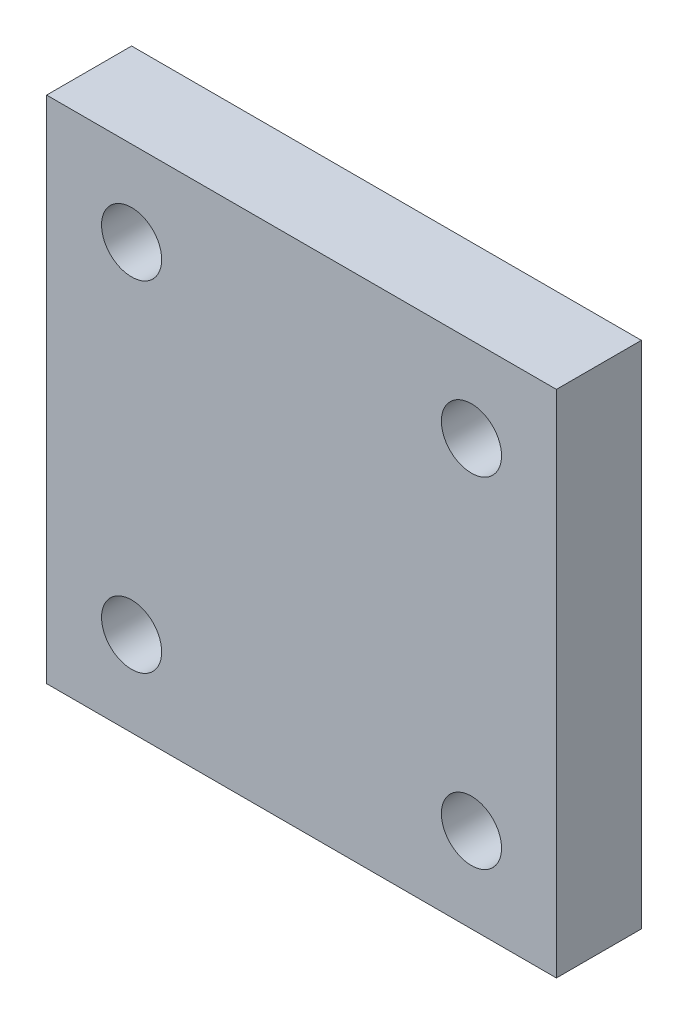
ISO-10303-21;
HEADER;
FILE_DESCRIPTION(('STEP AP214'),'2;1');
FILE_NAME('part.step','',(''),(''),'','','');
FILE_SCHEMA(('AUTOMOTIVE_DESIGN { 1 0 10303 214 1 1 1 1 }'));
ENDSEC;
DATA;
#1=APPLICATION_CONTEXT('core data for automotive mechanical design processes');
#2=APPLICATION_PROTOCOL_DEFINITION('international standard','automotive_design',2000,#1);
#3=PRODUCT_CONTEXT('',#1,'mechanical');
#4=PRODUCT('Part','Part','',(#3));
#5=PRODUCT_RELATED_PRODUCT_CATEGORY('part','',(#4));
#6=PRODUCT_DEFINITION_FORMATION('','',#4);
#7=PRODUCT_DEFINITION_CONTEXT('part definition',#1,'design');
#8=PRODUCT_DEFINITION('design','',#6,#7);
#9=PRODUCT_DEFINITION_SHAPE('','',#8);
#10=(LENGTH_UNIT() NAMED_UNIT(*) SI_UNIT(.MILLI.,.METRE.));
#11=(NAMED_UNIT(*) PLANE_ANGLE_UNIT() SI_UNIT($,.RADIAN.));
#12=(NAMED_UNIT(*) SI_UNIT($,.STERADIAN.) SOLID_ANGLE_UNIT());
#13=UNCERTAINTY_MEASURE_WITH_UNIT(LENGTH_MEASURE(1.E-05),#10,'distance_accuracy_value','');
#14=(GEOMETRIC_REPRESENTATION_CONTEXT(3) GLOBAL_UNCERTAINTY_ASSIGNED_CONTEXT((#13)) GLOBAL_UNIT_ASSIGNED_CONTEXT((#10,
#11,#12)) REPRESENTATION_CONTEXT('',''));
#15=CARTESIAN_POINT('',(0.,0.,0.));
#16=DIRECTION('',(0.,0.,1.));
#17=DIRECTION('',(1.,0.,0.));
#18=AXIS2_PLACEMENT_3D('',#15,#16,#17);
#19=CARTESIAN_POINT('',(0.,0.,6.35));
#20=DIRECTION('',(0.,0.,1.));
#21=DIRECTION('',(1.,0.,0.));
#22=AXIS2_PLACEMENT_3D('',#19,#20,#21);
#23=PLANE('',#22);
#24=CARTESIAN_POINT('',(12.7,-12.7,6.35));
#25=DIRECTION('',(0.,0.,1.));
#26=DIRECTION('',(1.,0.,0.));
#27=AXIS2_PLACEMENT_3D('',#24,#25,#26);
#28=CIRCLE('',#27,2.2479);
#29=CARTESIAN_POINT('',(14.9479,-12.7,6.35));
#30=VERTEX_POINT('',#29);
#31=EDGE_CURVE('E121',#30,#30,#28,.T.);
#32=ORIENTED_EDGE('',*,*,#31,.F.);
#33=EDGE_LOOP('',(#32));
#34=FACE_BOUND('',#33,.T.);
#35=CARTESIAN_POINT('',(-12.7,12.7,6.35));
#36=DIRECTION('',(0.,0.,1.));
#37=DIRECTION('',(1.,0.,0.));
#38=AXIS2_PLACEMENT_3D('',#35,#36,#37);
#39=CIRCLE('',#38,2.2479);
#40=CARTESIAN_POINT('',(-10.4521,12.7,6.35));
#41=VERTEX_POINT('',#40);
#42=EDGE_CURVE('E100',#41,#41,#39,.T.);
#43=ORIENTED_EDGE('',*,*,#42,.F.);
#44=EDGE_LOOP('',(#43));
#45=FACE_BOUND('',#44,.T.);
#46=DIRECTION('',(0.,1.,0.));
#47=VECTOR('',#46,1.);
#48=CARTESIAN_POINT('',(19.05,19.05,6.35));
#49=LINE('',#48,#47);
#50=CARTESIAN_POINT('',(19.05,-19.05,6.35));
#51=VERTEX_POINT('',#50);
#52=CARTESIAN_POINT('',(19.05,19.05,6.35));
#53=VERTEX_POINT('',#52);
#54=EDGE_CURVE('E85',#51,#53,#49,.T.);
#55=ORIENTED_EDGE('',*,*,#54,.T.);
#56=DIRECTION('',(-1.,0.,0.));
#57=VECTOR('',#56,1.);
#58=CARTESIAN_POINT('',(-19.05,19.05,6.35));
#59=LINE('',#58,#57);
#60=CARTESIAN_POINT('',(-19.05,19.05,6.35));
#61=VERTEX_POINT('',#60);
#62=EDGE_CURVE('E80',#53,#61,#59,.T.);
#63=ORIENTED_EDGE('',*,*,#62,.T.);
#64=DIRECTION('',(0.,-1.,0.));
#65=VECTOR('',#64,1.);
#66=CARTESIAN_POINT('',(-19.05,19.05,6.35));
#67=LINE('',#66,#65);
#68=CARTESIAN_POINT('',(-19.05,-19.05,6.35));
#69=VERTEX_POINT('',#68);
#70=EDGE_CURVE('E83',#61,#69,#67,.T.);
#71=ORIENTED_EDGE('',*,*,#70,.T.);
#72=DIRECTION('',(1.,0.,0.));
#73=VECTOR('',#72,1.);
#74=CARTESIAN_POINT('',(-19.05,-19.05,6.35));
#75=LINE('',#74,#73);
#76=EDGE_CURVE('E50',#69,#51,#75,.T.);
#77=ORIENTED_EDGE('',*,*,#76,.T.);
#78=EDGE_LOOP('',(#55,#63,#71,#77));
#79=FACE_BOUND('',#78,.T.);
#80=CARTESIAN_POINT('',(12.7,12.7,6.35));
#81=DIRECTION('',(0.,0.,1.));
#82=DIRECTION('',(1.,0.,0.));
#83=AXIS2_PLACEMENT_3D('',#80,#81,#82);
#84=CIRCLE('',#83,2.2479);
#85=CARTESIAN_POINT('',(14.9479,12.7,6.35));
#86=VERTEX_POINT('',#85);
#87=EDGE_CURVE('E115',#86,#86,#84,.T.);
#88=ORIENTED_EDGE('',*,*,#87,.F.);
#89=EDGE_LOOP('',(#88));
#90=FACE_BOUND('',#89,.T.);
#91=CARTESIAN_POINT('',(-12.7,-12.7,6.35));
#92=DIRECTION('',(0.,0.,1.));
#93=DIRECTION('',(1.,0.,0.));
#94=AXIS2_PLACEMENT_3D('',#91,#92,#93);
#95=CIRCLE('',#94,2.2479);
#96=CARTESIAN_POINT('',(-10.4521,-12.7,6.35));
#97=VERTEX_POINT('',#96);
#98=EDGE_CURVE('E127',#97,#97,#95,.T.);
#99=ORIENTED_EDGE('',*,*,#98,.F.);
#100=EDGE_LOOP('',(#99));
#101=FACE_BOUND('',#100,.T.);
#102=ADVANCED_FACE('F33',(#34,#45,#79,#90,#101),#23,.T.);
#103=CARTESIAN_POINT('',(0.,0.,0.));
#104=DIRECTION('',(0.,0.,1.));
#105=DIRECTION('',(1.,0.,0.));
#106=AXIS2_PLACEMENT_3D('',#103,#104,#105);
#107=PLANE('',#106);
#108=DIRECTION('',(0.,1.,0.));
#109=VECTOR('',#108,1.);
#110=CARTESIAN_POINT('',(19.05,19.05,0.));
#111=LINE('',#110,#109);
#112=CARTESIAN_POINT('',(19.05,-19.05,0.));
#113=VERTEX_POINT('',#112);
#114=CARTESIAN_POINT('',(19.05,19.05,0.));
#115=VERTEX_POINT('',#114);
#116=EDGE_CURVE('E97',#113,#115,#111,.T.);
#117=ORIENTED_EDGE('',*,*,#116,.F.);
#118=DIRECTION('',(1.,0.,0.));
#119=VECTOR('',#118,1.);
#120=CARTESIAN_POINT('',(-19.05,-19.05,0.));
#121=LINE('',#120,#119);
#122=CARTESIAN_POINT('',(-19.05,-19.05,0.));
#123=VERTEX_POINT('',#122);
#124=EDGE_CURVE('E73',#123,#113,#121,.T.);
#125=ORIENTED_EDGE('',*,*,#124,.F.);
#126=DIRECTION('',(0.,-1.,0.));
#127=VECTOR('',#126,1.);
#128=CARTESIAN_POINT('',(-19.05,19.05,0.));
#129=LINE('',#128,#127);
#130=CARTESIAN_POINT('',(-19.05,19.05,0.));
#131=VERTEX_POINT('',#130);
#132=EDGE_CURVE('E67',#131,#123,#129,.T.);
#133=ORIENTED_EDGE('',*,*,#132,.F.);
#134=DIRECTION('',(-1.,0.,0.));
#135=VECTOR('',#134,1.);
#136=CARTESIAN_POINT('',(-19.05,19.05,0.));
#137=LINE('',#136,#135);
#138=EDGE_CURVE('E89',#115,#131,#137,.T.);
#139=ORIENTED_EDGE('',*,*,#138,.F.);
#140=EDGE_LOOP('',(#117,#125,#133,#139));
#141=FACE_BOUND('',#140,.T.);
#142=CARTESIAN_POINT('',(-12.7,12.7,0.));
#143=DIRECTION('',(0.,0.,1.));
#144=DIRECTION('',(1.,0.,0.));
#145=AXIS2_PLACEMENT_3D('',#142,#143,#144);
#146=CIRCLE('',#145,2.2479);
#147=CARTESIAN_POINT('',(-10.4521,12.7,0.));
#148=VERTEX_POINT('',#147);
#149=EDGE_CURVE('E112',#148,#148,#146,.T.);
#150=ORIENTED_EDGE('',*,*,#149,.T.);
#151=EDGE_LOOP('',(#150));
#152=FACE_BOUND('',#151,.T.);
#153=CARTESIAN_POINT('',(12.7,12.7,0.));
#154=DIRECTION('',(0.,0.,1.));
#155=DIRECTION('',(1.,0.,0.));
#156=AXIS2_PLACEMENT_3D('',#153,#154,#155);
#157=CIRCLE('',#156,2.2479);
#158=CARTESIAN_POINT('',(14.9479,12.7,0.));
#159=VERTEX_POINT('',#158);
#160=EDGE_CURVE('E118',#159,#159,#157,.T.);
#161=ORIENTED_EDGE('',*,*,#160,.T.);
#162=EDGE_LOOP('',(#161));
#163=FACE_BOUND('',#162,.T.);
#164=CARTESIAN_POINT('',(12.7,-12.7,0.));
#165=DIRECTION('',(0.,0.,1.));
#166=DIRECTION('',(1.,0.,0.));
#167=AXIS2_PLACEMENT_3D('',#164,#165,#166);
#168=CIRCLE('',#167,2.2479);
#169=CARTESIAN_POINT('',(14.9479,-12.7,0.));
#170=VERTEX_POINT('',#169);
#171=EDGE_CURVE('E124',#170,#170,#168,.T.);
#172=ORIENTED_EDGE('',*,*,#171,.T.);
#173=EDGE_LOOP('',(#172));
#174=FACE_BOUND('',#173,.T.);
#175=CARTESIAN_POINT('',(-12.7,-12.7,0.));
#176=DIRECTION('',(0.,0.,1.));
#177=DIRECTION('',(1.,0.,0.));
#178=AXIS2_PLACEMENT_3D('',#175,#176,#177);
#179=CIRCLE('',#178,2.2479);
#180=CARTESIAN_POINT('',(-10.4521,-12.7,0.));
#181=VERTEX_POINT('',#180);
#182=EDGE_CURVE('E130',#181,#181,#179,.T.);
#183=ORIENTED_EDGE('',*,*,#182,.T.);
#184=EDGE_LOOP('',(#183));
#185=FACE_BOUND('',#184,.T.);
#186=ADVANCED_FACE('F108',(#141,#152,#163,#174,#185),#107,.F.);
#187=CARTESIAN_POINT('',(19.05,19.05,6.35));
#188=DIRECTION('',(-1.,0.,0.));
#189=DIRECTION('',(0.,0.,1.));
#190=AXIS2_PLACEMENT_3D('',#187,#188,#189);
#191=PLANE('',#190);
#192=ORIENTED_EDGE('',*,*,#116,.T.);
#193=DIRECTION('',(0.,0.,-1.));
#194=VECTOR('',#193,1.);
#195=CARTESIAN_POINT('',(19.05,19.05,6.35));
#196=LINE('',#195,#194);
#197=EDGE_CURVE('E11',#53,#115,#196,.T.);
#198=ORIENTED_EDGE('',*,*,#197,.F.);
#199=ORIENTED_EDGE('',*,*,#54,.F.);
#200=DIRECTION('',(0.,0.,-1.));
#201=VECTOR('',#200,1.);
#202=CARTESIAN_POINT('',(19.05,-19.05,6.35));
#203=LINE('',#202,#201);
#204=EDGE_CURVE('E93',#51,#113,#203,.T.);
#205=ORIENTED_EDGE('',*,*,#204,.T.);
#206=EDGE_LOOP('',(#192,#198,#199,#205));
#207=FACE_BOUND('',#206,.T.);
#208=ADVANCED_FACE('F35',(#207),#191,.F.);
#209=CARTESIAN_POINT('',(-19.05,19.05,6.35));
#210=DIRECTION('',(0.,-1.,0.));
#211=DIRECTION('',(0.,0.,-1.));
#212=AXIS2_PLACEMENT_3D('',#209,#210,#211);
#213=PLANE('',#212);
#214=ORIENTED_EDGE('',*,*,#138,.T.);
#215=DIRECTION('',(0.,0.,-1.));
#216=VECTOR('',#215,1.);
#217=CARTESIAN_POINT('',(-19.05,19.05,6.35));
#218=LINE('',#217,#216);
#219=EDGE_CURVE('E42',#61,#131,#218,.T.);
#220=ORIENTED_EDGE('',*,*,#219,.F.);
#221=ORIENTED_EDGE('',*,*,#62,.F.);
#222=ORIENTED_EDGE('',*,*,#197,.T.);
#223=EDGE_LOOP('',(#214,#220,#221,#222));
#224=FACE_BOUND('',#223,.T.);
#225=ADVANCED_FACE('F88',(#224),#213,.F.);
#226=CARTESIAN_POINT('',(-19.05,19.05,6.35));
#227=DIRECTION('',(1.,0.,0.));
#228=DIRECTION('',(0.,0.,-1.));
#229=AXIS2_PLACEMENT_3D('',#226,#227,#228);
#230=PLANE('',#229);
#231=ORIENTED_EDGE('',*,*,#132,.T.);
#232=DIRECTION('',(0.,0.,-1.));
#233=VECTOR('',#232,1.);
#234=CARTESIAN_POINT('',(-19.05,-19.05,6.35));
#235=LINE('',#234,#233);
#236=EDGE_CURVE('E90',#69,#123,#235,.T.);
#237=ORIENTED_EDGE('',*,*,#236,.F.);
#238=ORIENTED_EDGE('',*,*,#70,.F.);
#239=ORIENTED_EDGE('',*,*,#219,.T.);
#240=EDGE_LOOP('',(#231,#237,#238,#239));
#241=FACE_BOUND('',#240,.T.);
#242=ADVANCED_FACE('F91',(#241),#230,.F.);
#243=CARTESIAN_POINT('',(-19.05,-19.05,6.35));
#244=DIRECTION('',(0.,1.,0.));
#245=DIRECTION('',(0.,0.,1.));
#246=AXIS2_PLACEMENT_3D('',#243,#244,#245);
#247=PLANE('',#246);
#248=ORIENTED_EDGE('',*,*,#124,.T.);
#249=ORIENTED_EDGE('',*,*,#204,.F.);
#250=ORIENTED_EDGE('',*,*,#76,.F.);
#251=ORIENTED_EDGE('',*,*,#236,.T.);
#252=EDGE_LOOP('',(#248,#249,#250,#251));
#253=FACE_BOUND('',#252,.T.);
#254=ADVANCED_FACE('F105',(#253),#247,.F.);
#255=CARTESIAN_POINT('',(-12.7,12.7,6.35));
#256=DIRECTION('',(0.,0.,-1.));
#257=DIRECTION('',(-1.,0.,0.));
#258=AXIS2_PLACEMENT_3D('',#255,#256,#257);
#259=CYLINDRICAL_SURFACE('',#258,2.2479);
#260=ORIENTED_EDGE('',*,*,#42,.T.);
#261=EDGE_LOOP('',(#260));
#262=FACE_BOUND('',#261,.T.);
#263=ORIENTED_EDGE('',*,*,#149,.F.);
#264=EDGE_LOOP('',(#263));
#265=FACE_BOUND('',#264,.T.);
#266=ADVANCED_FACE('F149',(#262,#265),#259,.F.);
#267=CARTESIAN_POINT('',(12.7,12.7,6.35));
#268=DIRECTION('',(0.,0.,-1.));
#269=DIRECTION('',(-1.,0.,0.));
#270=AXIS2_PLACEMENT_3D('',#267,#268,#269);
#271=CYLINDRICAL_SURFACE('',#270,2.2479);
#272=ORIENTED_EDGE('',*,*,#87,.T.);
#273=EDGE_LOOP('',(#272));
#274=FACE_BOUND('',#273,.T.);
#275=ORIENTED_EDGE('',*,*,#160,.F.);
#276=EDGE_LOOP('',(#275));
#277=FACE_BOUND('',#276,.T.);
#278=ADVANCED_FACE('F195',(#274,#277),#271,.F.);
#279=CARTESIAN_POINT('',(12.7,-12.7,6.35));
#280=DIRECTION('',(0.,0.,-1.));
#281=DIRECTION('',(-1.,0.,0.));
#282=AXIS2_PLACEMENT_3D('',#279,#280,#281);
#283=CYLINDRICAL_SURFACE('',#282,2.2479);
#284=ORIENTED_EDGE('',*,*,#31,.T.);
#285=EDGE_LOOP('',(#284));
#286=FACE_BOUND('',#285,.T.);
#287=ORIENTED_EDGE('',*,*,#171,.F.);
#288=EDGE_LOOP('',(#287));
#289=FACE_BOUND('',#288,.T.);
#290=ADVANCED_FACE('F203',(#286,#289),#283,.F.);
#291=CARTESIAN_POINT('',(-12.7,-12.7,6.35));
#292=DIRECTION('',(0.,0.,-1.));
#293=DIRECTION('',(-1.,0.,0.));
#294=AXIS2_PLACEMENT_3D('',#291,#292,#293);
#295=CYLINDRICAL_SURFACE('',#294,2.2479);
#296=ORIENTED_EDGE('',*,*,#98,.T.);
#297=EDGE_LOOP('',(#296));
#298=FACE_BOUND('',#297,.T.);
#299=ORIENTED_EDGE('',*,*,#182,.F.);
#300=EDGE_LOOP('',(#299));
#301=FACE_BOUND('',#300,.T.);
#302=ADVANCED_FACE('F136',(#298,#301),#295,.F.);
#303=CLOSED_SHELL('',(#102,#186,#208,#225,#242,#254,#266,#278,#290,#302));
#304=MANIFOLD_SOLID_BREP('B2',#303);
#305=ADVANCED_BREP_SHAPE_REPRESENTATION('',(#18,#304),#14);
#306=SHAPE_DEFINITION_REPRESENTATION(#9,#305);
ENDSEC;
END-ISO-10303-21;
